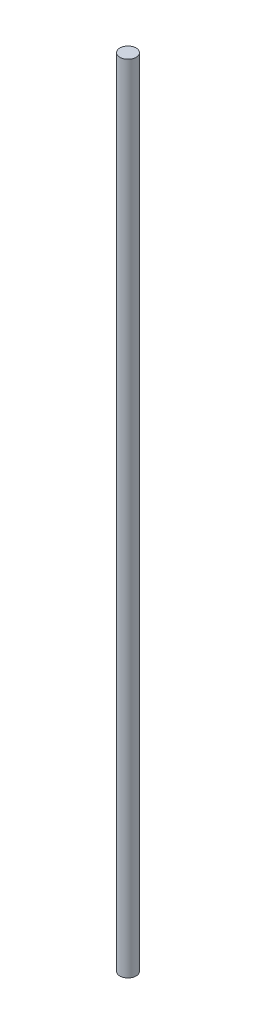
ISO-10303-21;
HEADER;
FILE_DESCRIPTION(('STEP AP214'),'2;1');
FILE_NAME('part.step','',(''),(''),'','','');
FILE_SCHEMA(('AUTOMOTIVE_DESIGN { 1 0 10303 214 1 1 1 1 }'));
ENDSEC;
DATA;
#1=APPLICATION_CONTEXT('core data for automotive mechanical design processes');
#2=APPLICATION_PROTOCOL_DEFINITION('international standard','automotive_design',2000,#1);
#3=PRODUCT_CONTEXT('',#1,'mechanical');
#4=PRODUCT('Part','Part','',(#3));
#5=PRODUCT_RELATED_PRODUCT_CATEGORY('part','',(#4));
#6=PRODUCT_DEFINITION_FORMATION('','',#4);
#7=PRODUCT_DEFINITION_CONTEXT('part definition',#1,'design');
#8=PRODUCT_DEFINITION('design','',#6,#7);
#9=PRODUCT_DEFINITION_SHAPE('','',#8);
#10=(LENGTH_UNIT() NAMED_UNIT(*) SI_UNIT(.MILLI.,.METRE.));
#11=(NAMED_UNIT(*) PLANE_ANGLE_UNIT() SI_UNIT($,.RADIAN.));
#12=(NAMED_UNIT(*) SI_UNIT($,.STERADIAN.) SOLID_ANGLE_UNIT());
#13=UNCERTAINTY_MEASURE_WITH_UNIT(LENGTH_MEASURE(1.E-05),#10,'distance_accuracy_value','');
#14=(GEOMETRIC_REPRESENTATION_CONTEXT(3) GLOBAL_UNCERTAINTY_ASSIGNED_CONTEXT((#13)) GLOBAL_UNIT_ASSIGNED_CONTEXT((#10,
#11,#12)) REPRESENTATION_CONTEXT('',''));
#15=CARTESIAN_POINT('',(0.,0.,0.));
#16=DIRECTION('',(0.,0.,1.));
#17=DIRECTION('',(1.,0.,0.));
#18=AXIS2_PLACEMENT_3D('',#15,#16,#17);
#19=CARTESIAN_POINT('',(0.,49.,0.));
#20=DIRECTION('',(0.,-1.,0.));
#21=DIRECTION('',(0.,0.,-1.));
#22=AXIS2_PLACEMENT_3D('',#19,#20,#21);
#23=CYLINDRICAL_SURFACE('',#22,0.5);
#24=CARTESIAN_POINT('',(0.,49.,0.));
#25=DIRECTION('',(0.,1.,0.));
#26=DIRECTION('',(0.,0.,1.));
#27=AXIS2_PLACEMENT_3D('',#24,#25,#26);
#28=CIRCLE('',#27,0.5);
#29=CARTESIAN_POINT('',(0.,49.,0.5));
#30=VERTEX_POINT('',#29);
#31=EDGE_CURVE('E10',#30,#30,#28,.T.);
#32=ORIENTED_EDGE('',*,*,#31,.F.);
#33=EDGE_LOOP('',(#32));
#34=FACE_BOUND('',#33,.T.);
#35=CARTESIAN_POINT('',(0.,0.,0.));
#36=DIRECTION('',(0.,1.,0.));
#37=DIRECTION('',(0.,0.,1.));
#38=AXIS2_PLACEMENT_3D('',#35,#36,#37);
#39=CIRCLE('',#38,0.5);
#40=CARTESIAN_POINT('',(0.,0.,0.5));
#41=VERTEX_POINT('',#40);
#42=EDGE_CURVE('E34',#41,#41,#39,.T.);
#43=ORIENTED_EDGE('',*,*,#42,.T.);
#44=EDGE_LOOP('',(#43));
#45=FACE_BOUND('',#44,.T.);
#46=ADVANCED_FACE('F31',(#34,#45),#23,.T.);
#47=CARTESIAN_POINT('',(0.,49.,0.));
#48=DIRECTION('',(0.,1.,0.));
#49=DIRECTION('',(0.,0.,1.));
#50=AXIS2_PLACEMENT_3D('',#47,#48,#49);
#51=PLANE('',#50);
#52=ORIENTED_EDGE('',*,*,#31,.T.);
#53=EDGE_LOOP('',(#52));
#54=FACE_BOUND('',#53,.T.);
#55=ADVANCED_FACE('F46',(#54),#51,.T.);
#56=CARTESIAN_POINT('',(0.,0.,0.));
#57=DIRECTION('',(0.,1.,0.));
#58=DIRECTION('',(0.,0.,1.));
#59=AXIS2_PLACEMENT_3D('',#56,#57,#58);
#60=PLANE('',#59);
#61=ORIENTED_EDGE('',*,*,#42,.F.);
#62=EDGE_LOOP('',(#61));
#63=FACE_BOUND('',#62,.T.);
#64=ADVANCED_FACE('F44',(#63),#60,.F.);
#65=CLOSED_SHELL('',(#46,#55,#64));
#66=MANIFOLD_SOLID_BREP('B2',#65);
#67=ADVANCED_BREP_SHAPE_REPRESENTATION('',(#18,#66),#14);
#68=SHAPE_DEFINITION_REPRESENTATION(#9,#67);
ENDSEC;
END-ISO-10303-21;
